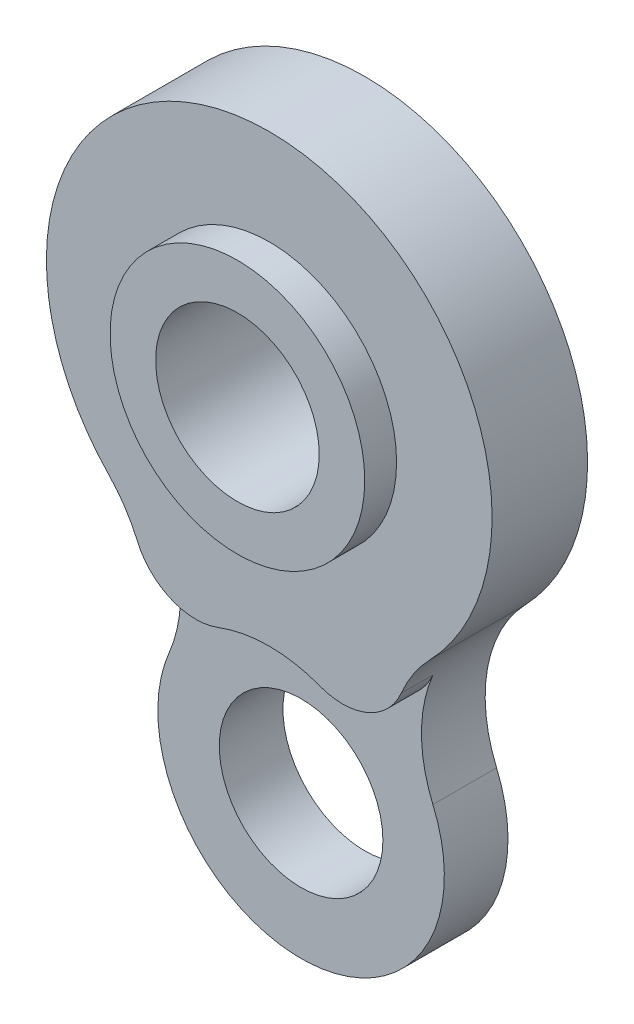
ISO-10303-21;
HEADER;
FILE_DESCRIPTION(('STEP AP214'),'2;1');
FILE_NAME('part.step','',(''),(''),'','','');
FILE_SCHEMA(('AUTOMOTIVE_DESIGN { 1 0 10303 214 1 1 1 1 }'));
ENDSEC;
DATA;
#1=APPLICATION_CONTEXT('core data for automotive mechanical design processes');
#2=APPLICATION_PROTOCOL_DEFINITION('international standard','automotive_design',2000,#1);
#3=PRODUCT_CONTEXT('',#1,'mechanical');
#4=PRODUCT('Part','Part','',(#3));
#5=PRODUCT_RELATED_PRODUCT_CATEGORY('part','',(#4));
#6=PRODUCT_DEFINITION_FORMATION('','',#4);
#7=PRODUCT_DEFINITION_CONTEXT('part definition',#1,'design');
#8=PRODUCT_DEFINITION('design','',#6,#7);
#9=PRODUCT_DEFINITION_SHAPE('','',#8);
#10=(LENGTH_UNIT() NAMED_UNIT(*) SI_UNIT(.MILLI.,.METRE.));
#11=(NAMED_UNIT(*) PLANE_ANGLE_UNIT() SI_UNIT($,.RADIAN.));
#12=(NAMED_UNIT(*) SI_UNIT($,.STERADIAN.) SOLID_ANGLE_UNIT());
#13=UNCERTAINTY_MEASURE_WITH_UNIT(LENGTH_MEASURE(1.E-05),#10,'distance_accuracy_value','');
#14=(GEOMETRIC_REPRESENTATION_CONTEXT(3) GLOBAL_UNCERTAINTY_ASSIGNED_CONTEXT((#13)) GLOBAL_UNIT_ASSIGNED_CONTEXT((#10,
#11,#12)) REPRESENTATION_CONTEXT('',''));
#15=CARTESIAN_POINT('',(0.,0.,0.));
#16=DIRECTION('',(0.,0.,1.));
#17=DIRECTION('',(1.,0.,0.));
#18=AXIS2_PLACEMENT_3D('',#15,#16,#17);
#19=CARTESIAN_POINT('',(0.,-9.128125,2.38125));
#20=DIRECTION('',(0.,0.,-1.));
#21=DIRECTION('',(-1.,0.,0.));
#22=AXIS2_PLACEMENT_3D('',#19,#20,#21);
#23=CYLINDRICAL_SURFACE('',#22,3.571875);
#24=CARTESIAN_POINT('',(0.,-9.128125,1.5875));
#25=DIRECTION('',(0.,0.,1.));
#26=DIRECTION('',(1.,0.,0.));
#27=AXIS2_PLACEMENT_3D('',#24,#25,#26);
#28=CIRCLE('',#27,3.571875);
#29=CARTESIAN_POINT('',(-3.28705842233351,-7.73043478260869,1.5875));
#30=VERTEX_POINT('',#29);
#31=CARTESIAN_POINT('',(3.28705842233351,-7.73043478260869,1.5875));
#32=VERTEX_POINT('',#31);
#33=EDGE_CURVE('E117',#30,#32,#28,.T.);
#34=ORIENTED_EDGE('',*,*,#33,.F.);
#35=DIRECTION('',(0.,0.,-1.));
#36=VECTOR('',#35,1.);
#37=CARTESIAN_POINT('',(-3.28705842233351,-7.73043478260869,2.38125));
#38=LINE('',#37,#36);
#39=CARTESIAN_POINT('',(-3.28705842233351,-7.73043478260869,0.));
#40=VERTEX_POINT('',#39);
#41=EDGE_CURVE('E163',#30,#40,#38,.T.);
#42=ORIENTED_EDGE('',*,*,#41,.T.);
#43=CARTESIAN_POINT('',(0.,-9.128125,0.));
#44=DIRECTION('',(0.,0.,1.));
#45=DIRECTION('',(1.,0.,0.));
#46=AXIS2_PLACEMENT_3D('',#43,#44,#45);
#47=CIRCLE('',#46,3.571875);
#48=CARTESIAN_POINT('',(3.28705842233351,-7.73043478260869,0.));
#49=VERTEX_POINT('',#48);
#50=EDGE_CURVE('E125',#40,#49,#47,.T.);
#51=ORIENTED_EDGE('',*,*,#50,.T.);
#52=DIRECTION('',(0.,0.,-1.));
#53=VECTOR('',#52,1.);
#54=CARTESIAN_POINT('',(3.28705842233351,-7.73043478260869,2.38125));
#55=LINE('',#54,#53);
#56=EDGE_CURVE('E110',#32,#49,#55,.T.);
#57=ORIENTED_EDGE('',*,*,#56,.F.);
#58=EDGE_LOOP('',(#34,#42,#51,#57));
#59=FACE_BOUND('',#58,.T.);
#60=ADVANCED_FACE('F40',(#59),#23,.T.);
#61=CARTESIAN_POINT('',(0.,-9.128125,2.38125));
#62=DIRECTION('',(0.,0.,-1.));
#63=DIRECTION('',(-1.,0.,0.));
#64=AXIS2_PLACEMENT_3D('',#61,#62,#63);
#65=CYLINDRICAL_SURFACE('',#64,2.0399375);
#66=CARTESIAN_POINT('',(0.,-9.128125,0.));
#67=DIRECTION('',(0.,0.,1.));
#68=DIRECTION('',(1.,0.,0.));
#69=AXIS2_PLACEMENT_3D('',#66,#67,#68);
#70=CIRCLE('',#69,2.0399375);
#71=CARTESIAN_POINT('',(2.0399375,-9.128125,0.));
#72=VERTEX_POINT('',#71);
#73=EDGE_CURVE('E192',#72,#72,#70,.T.);
#74=ORIENTED_EDGE('',*,*,#73,.F.);
#75=EDGE_LOOP('',(#74));
#76=FACE_BOUND('',#75,.T.);
#77=CARTESIAN_POINT('',(0.,-9.128125,1.5875));
#78=DIRECTION('',(0.,0.,1.));
#79=DIRECTION('',(1.,0.,0.));
#80=AXIS2_PLACEMENT_3D('',#77,#78,#79);
#81=CIRCLE('',#80,2.0399375);
#82=CARTESIAN_POINT('',(2.0399375,-9.128125,1.5875));
#83=VERTEX_POINT('',#82);
#84=EDGE_CURVE('E177',#83,#83,#81,.T.);
#85=ORIENTED_EDGE('',*,*,#84,.T.);
#86=EDGE_LOOP('',(#85));
#87=FACE_BOUND('',#86,.T.);
#88=ADVANCED_FACE('F240',(#76,#87),#65,.F.);
#89=CARTESIAN_POINT('',(6.57411684466701,-6.33274456521739,2.38125));
#90=DIRECTION('',(0.,0.,-1.));
#91=DIRECTION('',(-1.,0.,0.));
#92=AXIS2_PLACEMENT_3D('',#89,#90,#91);
#93=CYLINDRICAL_SURFACE('',#92,3.571875);
#94=CARTESIAN_POINT('',(6.57411684466701,-6.33274456521739,2.38125));
#95=DIRECTION('',(0.,0.,1.));
#96=DIRECTION('',(1.,0.,0.));
#97=AXIS2_PLACEMENT_3D('',#94,#95,#96);
#98=CIRCLE('',#97,3.571875);
#99=CARTESIAN_POINT('',(4.0016363402321,-3.8547140831758,2.38125));
#100=VERTEX_POINT('',#99);
#101=CARTESIAN_POINT('',(3.28988436412794,-4.92842692686161,2.38125));
#102=VERTEX_POINT('',#101);
#103=EDGE_CURVE('E196',#100,#102,#98,.T.);
#104=ORIENTED_EDGE('',*,*,#103,.T.);
#105=DIRECTION('',(0.,0.,-1.));
#106=VECTOR('',#105,1.);
#107=CARTESIAN_POINT('',(3.28988436412794,-4.92842692686161,2.38125));
#108=LINE('',#107,#106);
#109=CARTESIAN_POINT('',(3.28988436412794,-4.92842692686161,1.5875));
#110=VERTEX_POINT('',#109);
#111=EDGE_CURVE('E112',#102,#110,#108,.T.);
#112=ORIENTED_EDGE('',*,*,#111,.T.);
#113=CARTESIAN_POINT('',(6.57411684466701,-6.33274456521739,1.5875));
#114=DIRECTION('',(0.,0.,1.));
#115=DIRECTION('',(1.,0.,0.));
#116=AXIS2_PLACEMENT_3D('',#113,#114,#115);
#117=CIRCLE('',#116,3.571875);
#118=EDGE_CURVE('E105',#110,#32,#117,.T.);
#119=ORIENTED_EDGE('',*,*,#118,.T.);
#120=ORIENTED_EDGE('',*,*,#56,.T.);
#121=CARTESIAN_POINT('',(6.57411684466701,-6.33274456521739,0.));
#122=DIRECTION('',(0.,0.,1.));
#123=DIRECTION('',(1.,0.,0.));
#124=AXIS2_PLACEMENT_3D('',#121,#122,#123);
#125=CIRCLE('',#124,3.571875);
#126=CARTESIAN_POINT('',(4.0016363402321,-3.8547140831758,0.));
#127=VERTEX_POINT('',#126);
#128=EDGE_CURVE('E214',#127,#49,#125,.T.);
#129=ORIENTED_EDGE('',*,*,#128,.F.);
#130=DIRECTION('',(0.,0.,-1.));
#131=VECTOR('',#130,1.);
#132=CARTESIAN_POINT('',(4.0016363402321,-3.8547140831758,2.38125));
#133=LINE('',#132,#131);
#134=EDGE_CURVE('E129',#100,#127,#133,.T.);
#135=ORIENTED_EDGE('',*,*,#134,.F.);
#136=EDGE_LOOP('',(#104,#112,#119,#120,#129,#135));
#137=FACE_BOUND('',#136,.T.);
#138=ADVANCED_FACE('F107',(#137),#93,.F.);
#139=CARTESIAN_POINT('',(0.,0.,2.38125));
#140=DIRECTION('',(0.,0.,-1.));
#141=DIRECTION('',(-1.,0.,0.));
#142=AXIS2_PLACEMENT_3D('',#139,#140,#141);
#143=CYLINDRICAL_SURFACE('',#142,5.55625);
#144=CARTESIAN_POINT('',(0.,0.,0.));
#145=DIRECTION('',(0.,0.,1.));
#146=DIRECTION('',(1.,0.,0.));
#147=AXIS2_PLACEMENT_3D('',#144,#145,#146);
#148=CIRCLE('',#147,5.55625);
#149=CARTESIAN_POINT('',(-4.0016363402321,-3.8547140831758,0.));
#150=VERTEX_POINT('',#149);
#151=EDGE_CURVE('E217',#127,#150,#148,.T.);
#152=ORIENTED_EDGE('',*,*,#151,.T.);
#153=DIRECTION('',(0.,0.,-1.));
#154=VECTOR('',#153,1.);
#155=CARTESIAN_POINT('',(-4.0016363402321,-3.8547140831758,2.38125));
#156=LINE('',#155,#154);
#157=CARTESIAN_POINT('',(-4.0016363402321,-3.8547140831758,2.38125));
#158=VERTEX_POINT('',#157);
#159=EDGE_CURVE('E135',#158,#150,#156,.T.);
#160=ORIENTED_EDGE('',*,*,#159,.F.);
#161=CARTESIAN_POINT('',(0.,0.,2.38125));
#162=DIRECTION('',(0.,0.,1.));
#163=DIRECTION('',(1.,0.,0.));
#164=AXIS2_PLACEMENT_3D('',#161,#162,#163);
#165=CIRCLE('',#164,5.55625);
#166=EDGE_CURVE('E199',#100,#158,#165,.T.);
#167=ORIENTED_EDGE('',*,*,#166,.F.);
#168=ORIENTED_EDGE('',*,*,#134,.T.);
#169=EDGE_LOOP('',(#152,#160,#167,#168));
#170=FACE_BOUND('',#169,.T.);
#171=ADVANCED_FACE('F230',(#170),#143,.T.);
#172=CARTESIAN_POINT('',(-6.57411684466701,-6.33274456521739,2.38125));
#173=DIRECTION('',(0.,0.,-1.));
#174=DIRECTION('',(-1.,0.,0.));
#175=AXIS2_PLACEMENT_3D('',#172,#173,#174);
#176=CYLINDRICAL_SURFACE('',#175,3.571875);
#177=ORIENTED_EDGE('',*,*,#41,.F.);
#178=CARTESIAN_POINT('',(-6.57411684466701,-6.33274456521739,1.5875));
#179=DIRECTION('',(0.,0.,1.));
#180=DIRECTION('',(1.,0.,0.));
#181=AXIS2_PLACEMENT_3D('',#178,#179,#180);
#182=CIRCLE('',#181,3.571875);
#183=CARTESIAN_POINT('',(-3.28988436412794,-4.92842692686161,1.5875));
#184=VERTEX_POINT('',#183);
#185=EDGE_CURVE('E56',#30,#184,#182,.T.);
#186=ORIENTED_EDGE('',*,*,#185,.T.);
#187=DIRECTION('',(0.,0.,-1.));
#188=VECTOR('',#187,1.);
#189=CARTESIAN_POINT('',(-3.28988436412794,-4.92842692686161,2.38125));
#190=LINE('',#189,#188);
#191=CARTESIAN_POINT('',(-3.28988436412794,-4.92842692686161,2.38125));
#192=VERTEX_POINT('',#191);
#193=EDGE_CURVE('E142',#184,#192,#190,.F.);
#194=ORIENTED_EDGE('',*,*,#193,.T.);
#195=CARTESIAN_POINT('',(-6.57411684466701,-6.33274456521739,2.38125));
#196=DIRECTION('',(0.,0.,1.));
#197=DIRECTION('',(1.,0.,0.));
#198=AXIS2_PLACEMENT_3D('',#195,#196,#197);
#199=CIRCLE('',#198,3.571875);
#200=EDGE_CURVE('E173',#192,#158,#199,.T.);
#201=ORIENTED_EDGE('',*,*,#200,.T.);
#202=ORIENTED_EDGE('',*,*,#159,.T.);
#203=CARTESIAN_POINT('',(-6.57411684466701,-6.33274456521739,0.));
#204=DIRECTION('',(0.,0.,1.));
#205=DIRECTION('',(1.,0.,0.));
#206=AXIS2_PLACEMENT_3D('',#203,#204,#205);
#207=CIRCLE('',#206,3.571875);
#208=EDGE_CURVE('E200',#40,#150,#207,.T.);
#209=ORIENTED_EDGE('',*,*,#208,.F.);
#210=EDGE_LOOP('',(#177,#186,#194,#201,#202,#209));
#211=FACE_BOUND('',#210,.T.);
#212=ADVANCED_FACE('F160',(#211),#176,.F.);
#213=CARTESIAN_POINT('',(0.,0.,2.38125));
#214=DIRECTION('',(0.,0.,1.));
#215=DIRECTION('',(1.,0.,0.));
#216=AXIS2_PLACEMENT_3D('',#213,#214,#215);
#217=PLANE('',#216);
#218=ORIENTED_EDGE('',*,*,#200,.F.);
#219=CARTESIAN_POINT('',(-1.83022548388835,-4.30428575425905,2.38125));
#220=DIRECTION('',(0.,0.,1.));
#221=DIRECTION('',(1.,0.,0.));
#222=AXIS2_PLACEMENT_3D('',#219,#220,#221);
#223=CIRCLE('',#222,1.5875);
#224=CARTESIAN_POINT('',(-1.26707918115347,-5.7885439837178,2.38125));
#225=VERTEX_POINT('',#224);
#226=EDGE_CURVE('E114',#192,#225,#223,.T.);
#227=ORIENTED_EDGE('',*,*,#226,.T.);
#228=CARTESIAN_POINT('',(0.,-9.128125,2.38125));
#229=DIRECTION('',(0.,0.,1.));
#230=DIRECTION('',(1.,0.,0.));
#231=AXIS2_PLACEMENT_3D('',#228,#229,#230);
#232=CIRCLE('',#231,3.571875);
#233=CARTESIAN_POINT('',(1.26707918115347,-5.7885439837178,2.38125));
#234=VERTEX_POINT('',#233);
#235=EDGE_CURVE('E122',#234,#225,#232,.T.);
#236=ORIENTED_EDGE('',*,*,#235,.F.);
#237=CARTESIAN_POINT('',(1.83022548388835,-4.30428575425905,2.38125));
#238=DIRECTION('',(0.,0.,1.));
#239=DIRECTION('',(1.,0.,0.));
#240=AXIS2_PLACEMENT_3D('',#237,#238,#239);
#241=CIRCLE('',#240,1.5875);
#242=EDGE_CURVE('E147',#234,#102,#241,.T.);
#243=ORIENTED_EDGE('',*,*,#242,.T.);
#244=ORIENTED_EDGE('',*,*,#103,.F.);
#245=ORIENTED_EDGE('',*,*,#166,.T.);
#246=EDGE_LOOP('',(#218,#227,#236,#243,#244,#245));
#247=FACE_BOUND('',#246,.T.);
#248=CARTESIAN_POINT('',(0.,0.,2.38125));
#249=DIRECTION('',(0.,0.,1.));
#250=DIRECTION('',(1.,0.,0.));
#251=AXIS2_PLACEMENT_3D('',#248,#249,#250);
#252=CIRCLE('',#251,3.175);
#253=CARTESIAN_POINT('',(3.175,0.,2.38125));
#254=VERTEX_POINT('',#253);
#255=EDGE_CURVE('E205',#254,#254,#252,.T.);
#256=ORIENTED_EDGE('',*,*,#255,.F.);
#257=EDGE_LOOP('',(#256));
#258=FACE_BOUND('',#257,.T.);
#259=ADVANCED_FACE('F169',(#247,#258),#217,.T.);
#260=CARTESIAN_POINT('',(0.,0.,0.));
#261=DIRECTION('',(0.,0.,1.));
#262=DIRECTION('',(1.,0.,0.));
#263=AXIS2_PLACEMENT_3D('',#260,#261,#262);
#264=PLANE('',#263);
#265=ORIENTED_EDGE('',*,*,#73,.T.);
#266=EDGE_LOOP('',(#265));
#267=FACE_BOUND('',#266,.T.);
#268=ORIENTED_EDGE('',*,*,#50,.F.);
#269=ORIENTED_EDGE('',*,*,#208,.T.);
#270=ORIENTED_EDGE('',*,*,#151,.F.);
#271=ORIENTED_EDGE('',*,*,#128,.T.);
#272=EDGE_LOOP('',(#268,#269,#270,#271));
#273=FACE_BOUND('',#272,.T.);
#274=CARTESIAN_POINT('',(0.,0.,0.));
#275=DIRECTION('',(0.,0.,1.));
#276=DIRECTION('',(1.,0.,0.));
#277=AXIS2_PLACEMENT_3D('',#274,#275,#276);
#278=CIRCLE('',#277,2.0399375);
#279=CARTESIAN_POINT('',(2.0399375,0.,0.));
#280=VERTEX_POINT('',#279);
#281=EDGE_CURVE('E188',#280,#280,#278,.T.);
#282=ORIENTED_EDGE('',*,*,#281,.T.);
#283=EDGE_LOOP('',(#282));
#284=FACE_BOUND('',#283,.T.);
#285=ADVANCED_FACE('F232',(#267,#273,#284),#264,.F.);
#286=CARTESIAN_POINT('',(0.,0.,3.175));
#287=DIRECTION('',(0.,0.,-1.));
#288=DIRECTION('',(-1.,0.,0.));
#289=AXIS2_PLACEMENT_3D('',#286,#287,#288);
#290=CYLINDRICAL_SURFACE('',#289,2.0399375);
#291=CARTESIAN_POINT('',(0.,0.,3.175));
#292=DIRECTION('',(0.,0.,1.));
#293=DIRECTION('',(1.,0.,0.));
#294=AXIS2_PLACEMENT_3D('',#291,#292,#293);
#295=CIRCLE('',#294,2.0399375);
#296=CARTESIAN_POINT('',(2.0399375,0.,3.175));
#297=VERTEX_POINT('',#296);
#298=EDGE_CURVE('E183',#297,#297,#295,.T.);
#299=ORIENTED_EDGE('',*,*,#298,.T.);
#300=EDGE_LOOP('',(#299));
#301=FACE_BOUND('',#300,.T.);
#302=ORIENTED_EDGE('',*,*,#281,.F.);
#303=EDGE_LOOP('',(#302));
#304=FACE_BOUND('',#303,.T.);
#305=ADVANCED_FACE('F257',(#301,#304),#290,.F.);
#306=CARTESIAN_POINT('',(0.,0.,3.175));
#307=DIRECTION('',(0.,0.,-1.));
#308=DIRECTION('',(-1.,0.,0.));
#309=AXIS2_PLACEMENT_3D('',#306,#307,#308);
#310=CYLINDRICAL_SURFACE('',#309,3.175);
#311=ORIENTED_EDGE('',*,*,#255,.T.);
#312=EDGE_LOOP('',(#311));
#313=FACE_BOUND('',#312,.T.);
#314=CARTESIAN_POINT('',(0.,0.,3.175));
#315=DIRECTION('',(0.,0.,1.));
#316=DIRECTION('',(1.,0.,0.));
#317=AXIS2_PLACEMENT_3D('',#314,#315,#316);
#318=CIRCLE('',#317,3.175);
#319=CARTESIAN_POINT('',(3.175,0.,3.175));
#320=VERTEX_POINT('',#319);
#321=EDGE_CURVE('E187',#320,#320,#318,.T.);
#322=ORIENTED_EDGE('',*,*,#321,.F.);
#323=EDGE_LOOP('',(#322));
#324=FACE_BOUND('',#323,.T.);
#325=ADVANCED_FACE('F263',(#313,#324),#310,.T.);
#326=CARTESIAN_POINT('',(0.,0.,3.175));
#327=DIRECTION('',(0.,0.,1.));
#328=DIRECTION('',(1.,0.,0.));
#329=AXIS2_PLACEMENT_3D('',#326,#327,#328);
#330=PLANE('',#329);
#331=ORIENTED_EDGE('',*,*,#298,.F.);
#332=EDGE_LOOP('',(#331));
#333=FACE_BOUND('',#332,.T.);
#334=ORIENTED_EDGE('',*,*,#321,.T.);
#335=EDGE_LOOP('',(#334));
#336=FACE_BOUND('',#335,.T.);
#337=ADVANCED_FACE('F267',(#333,#336),#330,.T.);
#338=CARTESIAN_POINT('',(0.,-9.128125,1.5875));
#339=DIRECTION('',(0.,0.,1.));
#340=DIRECTION('',(1.,0.,0.));
#341=AXIS2_PLACEMENT_3D('',#338,#339,#340);
#342=CYLINDRICAL_SURFACE('',#341,3.571875);
#343=ORIENTED_EDGE('',*,*,#235,.T.);
#344=DIRECTION('',(0.,0.,1.));
#345=VECTOR('',#344,1.);
#346=CARTESIAN_POINT('',(-1.26707918115347,-5.7885439837178,1.5875));
#347=LINE('',#346,#345);
#348=CARTESIAN_POINT('',(-1.26707918115347,-5.7885439837178,1.5875));
#349=VERTEX_POINT('',#348);
#350=EDGE_CURVE('E133',#225,#349,#347,.F.);
#351=ORIENTED_EDGE('',*,*,#350,.T.);
#352=CARTESIAN_POINT('',(1.26707918115347,-5.7885439837178,1.5875));
#353=VERTEX_POINT('',#352);
#354=EDGE_CURVE('E121',#353,#349,#28,.T.);
#355=ORIENTED_EDGE('',*,*,#354,.F.);
#356=DIRECTION('',(0.,0.,1.));
#357=VECTOR('',#356,1.);
#358=CARTESIAN_POINT('',(1.26707918115347,-5.7885439837178,1.5875));
#359=LINE('',#358,#357);
#360=EDGE_CURVE('E128',#353,#234,#359,.T.);
#361=ORIENTED_EDGE('',*,*,#360,.T.);
#362=EDGE_LOOP('',(#343,#351,#355,#361));
#363=FACE_BOUND('',#362,.T.);
#364=ADVANCED_FACE('F175',(#363),#342,.F.);
#365=CARTESIAN_POINT('',(0.,-9.128125,1.5875));
#366=DIRECTION('',(0.,0.,1.));
#367=DIRECTION('',(1.,0.,0.));
#368=AXIS2_PLACEMENT_3D('',#365,#366,#367);
#369=PLANE('',#368);
#370=ORIENTED_EDGE('',*,*,#84,.F.);
#371=EDGE_LOOP('',(#370));
#372=FACE_BOUND('',#371,.T.);
#373=ORIENTED_EDGE('',*,*,#33,.T.);
#374=ORIENTED_EDGE('',*,*,#118,.F.);
#375=CARTESIAN_POINT('',(1.83022548388835,-4.30428575425905,1.5875));
#376=DIRECTION('',(0.,0.,1.));
#377=DIRECTION('',(1.,0.,0.));
#378=AXIS2_PLACEMENT_3D('',#375,#376,#377);
#379=CIRCLE('',#378,1.5875);
#380=EDGE_CURVE('E11',#110,#353,#379,.F.);
#381=ORIENTED_EDGE('',*,*,#380,.T.);
#382=ORIENTED_EDGE('',*,*,#354,.T.);
#383=CARTESIAN_POINT('',(-1.83022548388835,-4.30428575425905,1.5875));
#384=DIRECTION('',(0.,0.,1.));
#385=DIRECTION('',(1.,0.,0.));
#386=AXIS2_PLACEMENT_3D('',#383,#384,#385);
#387=CIRCLE('',#386,1.5875);
#388=EDGE_CURVE('E49',#349,#184,#387,.F.);
#389=ORIENTED_EDGE('',*,*,#388,.T.);
#390=ORIENTED_EDGE('',*,*,#185,.F.);
#391=EDGE_LOOP('',(#373,#374,#381,#382,#389,#390));
#392=FACE_BOUND('',#391,.T.);
#393=ADVANCED_FACE('F118',(#372,#392),#369,.T.);
#394=CARTESIAN_POINT('',(-1.83022548388835,-4.30428575425905,2.38125));
#395=DIRECTION('',(0.,0.,-1.));
#396=DIRECTION('',(-1.,0.,0.));
#397=AXIS2_PLACEMENT_3D('',#394,#395,#396);
#398=CYLINDRICAL_SURFACE('',#397,1.5875);
#399=ORIENTED_EDGE('',*,*,#226,.F.);
#400=ORIENTED_EDGE('',*,*,#193,.F.);
#401=ORIENTED_EDGE('',*,*,#388,.F.);
#402=ORIENTED_EDGE('',*,*,#350,.F.);
#403=EDGE_LOOP('',(#399,#400,#401,#402));
#404=FACE_BOUND('',#403,.T.);
#405=ADVANCED_FACE('F165',(#404),#398,.T.);
#406=CARTESIAN_POINT('',(1.83022548388835,-4.30428575425905,1.5875));
#407=DIRECTION('',(0.,0.,-1.));
#408=DIRECTION('',(-1.,0.,0.));
#409=AXIS2_PLACEMENT_3D('',#406,#407,#408);
#410=CYLINDRICAL_SURFACE('',#409,1.5875);
#411=ORIENTED_EDGE('',*,*,#242,.F.);
#412=ORIENTED_EDGE('',*,*,#360,.F.);
#413=ORIENTED_EDGE('',*,*,#380,.F.);
#414=ORIENTED_EDGE('',*,*,#111,.F.);
#415=EDGE_LOOP('',(#411,#412,#413,#414));
#416=FACE_BOUND('',#415,.T.);
#417=ADVANCED_FACE('F42',(#416),#410,.T.);
#418=CLOSED_SHELL('',(#60,#88,#138,#171,#212,#259,#285,#305,#325,#337,#364,#393,#405,#417));
#419=MANIFOLD_SOLID_BREP('B2',#418);
#420=ADVANCED_BREP_SHAPE_REPRESENTATION('',(#18,#419),#14);
#421=SHAPE_DEFINITION_REPRESENTATION(#9,#420);
ENDSEC;
END-ISO-10303-21;
